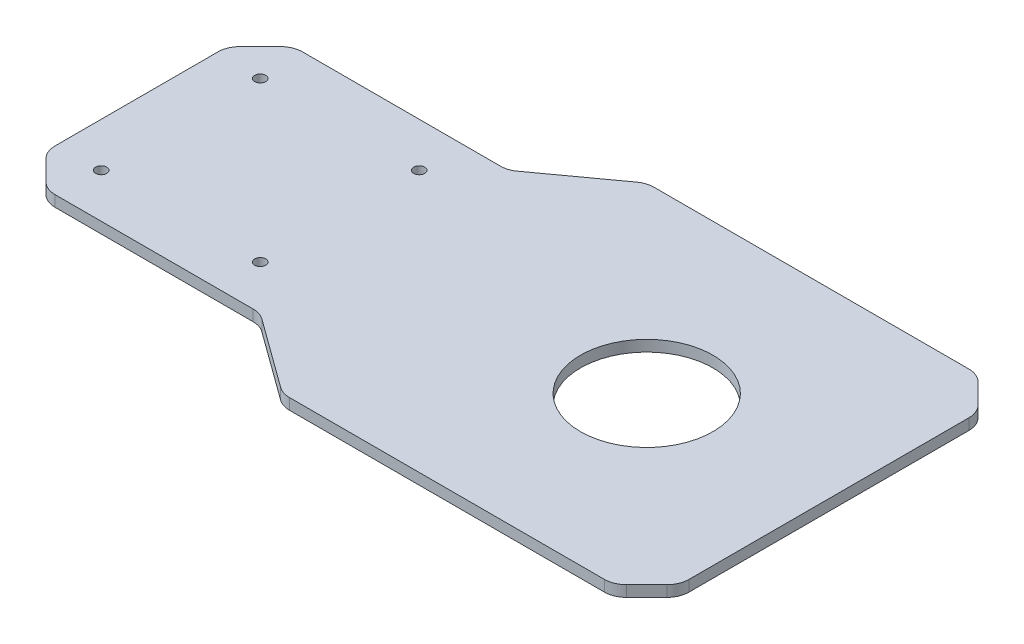
ISO-10303-21;
HEADER;
FILE_DESCRIPTION(('STEP AP214'),'2;1');
FILE_NAME('part.step','',(''),(''),'','','');
FILE_SCHEMA(('AUTOMOTIVE_DESIGN { 1 0 10303 214 1 1 1 1 }'));
ENDSEC;
DATA;
#1=APPLICATION_CONTEXT('core data for automotive mechanical design processes');
#2=APPLICATION_PROTOCOL_DEFINITION('international standard','automotive_design',2000,#1);
#3=PRODUCT_CONTEXT('',#1,'mechanical');
#4=PRODUCT('Part','Part','',(#3));
#5=PRODUCT_RELATED_PRODUCT_CATEGORY('part','',(#4));
#6=PRODUCT_DEFINITION_FORMATION('','',#4);
#7=PRODUCT_DEFINITION_CONTEXT('part definition',#1,'design');
#8=PRODUCT_DEFINITION('design','',#6,#7);
#9=PRODUCT_DEFINITION_SHAPE('','',#8);
#10=(LENGTH_UNIT() NAMED_UNIT(*) SI_UNIT(.MILLI.,.METRE.));
#11=(NAMED_UNIT(*) PLANE_ANGLE_UNIT() SI_UNIT($,.RADIAN.));
#12=(NAMED_UNIT(*) SI_UNIT($,.STERADIAN.) SOLID_ANGLE_UNIT());
#13=UNCERTAINTY_MEASURE_WITH_UNIT(LENGTH_MEASURE(1.E-05),#10,'distance_accuracy_value','');
#14=(GEOMETRIC_REPRESENTATION_CONTEXT(3) GLOBAL_UNCERTAINTY_ASSIGNED_CONTEXT((#13)) GLOBAL_UNIT_ASSIGNED_CONTEXT((#10,
#11,#12)) REPRESENTATION_CONTEXT('',''));
#15=CARTESIAN_POINT('',(0.,0.,0.));
#16=DIRECTION('',(0.,0.,1.));
#17=DIRECTION('',(1.,0.,0.));
#18=AXIS2_PLACEMENT_3D('',#15,#16,#17);
#19=CARTESIAN_POINT('',(257.5,5.,-82.5));
#20=DIRECTION('',(-1.,0.,0.));
#21=DIRECTION('',(0.,0.,1.));
#22=AXIS2_PLACEMENT_3D('',#19,#20,#21);
#23=PLANE('',#22);
#24=DIRECTION('',(0.,0.,-1.));
#25=VECTOR('',#24,1.);
#26=CARTESIAN_POINT('',(257.5,0.,-82.5));
#27=LINE('',#26,#25);
#28=CARTESIAN_POINT('',(257.5,0.,63.3578643762691));
#29=VERTEX_POINT('',#28);
#30=CARTESIAN_POINT('',(257.5,0.,-63.357864376269));
#31=VERTEX_POINT('',#30);
#32=EDGE_CURVE('E362',#29,#31,#27,.T.);
#33=ORIENTED_EDGE('',*,*,#32,.T.);
#34=DIRECTION('',(0.,-1.,0.));
#35=VECTOR('',#34,1.);
#36=CARTESIAN_POINT('',(257.5,5.,-63.357864376269));
#37=LINE('',#36,#35);
#38=CARTESIAN_POINT('',(257.5,5.,-63.357864376269));
#39=VERTEX_POINT('',#38);
#40=EDGE_CURVE('E297',#31,#39,#37,.F.);
#41=ORIENTED_EDGE('',*,*,#40,.T.);
#42=DIRECTION('',(0.,0.,-1.));
#43=VECTOR('',#42,1.);
#44=CARTESIAN_POINT('',(257.5,5.,-82.5));
#45=LINE('',#44,#43);
#46=CARTESIAN_POINT('',(257.5,5.,63.3578643762691));
#47=VERTEX_POINT('',#46);
#48=EDGE_CURVE('E379',#47,#39,#45,.T.);
#49=ORIENTED_EDGE('',*,*,#48,.F.);
#50=DIRECTION('',(0.,1.,0.));
#51=VECTOR('',#50,1.);
#52=CARTESIAN_POINT('',(257.5,0.,63.3578643762691));
#53=LINE('',#52,#51);
#54=EDGE_CURVE('E294',#47,#29,#53,.F.);
#55=ORIENTED_EDGE('',*,*,#54,.T.);
#56=EDGE_LOOP('',(#33,#41,#49,#55));
#57=FACE_BOUND('',#56,.T.);
#58=ADVANCED_FACE('F38',(#57),#23,.F.);
#59=CARTESIAN_POINT('',(92.5,5.,-82.5));
#60=DIRECTION('',(0.,0.,1.));
#61=DIRECTION('',(1.,0.,0.));
#62=AXIS2_PLACEMENT_3D('',#59,#60,#61);
#63=PLANE('',#62);
#64=DIRECTION('',(-1.,0.,0.));
#65=VECTOR('',#64,1.);
#66=CARTESIAN_POINT('',(92.5,5.,-82.5));
#67=LINE('',#66,#65);
#68=CARTESIAN_POINT('',(238.357864376269,5.,-82.5));
#69=VERTEX_POINT('',#68);
#70=CARTESIAN_POINT('',(95.7473328473115,5.,-82.5));
#71=VERTEX_POINT('',#70);
#72=EDGE_CURVE('E349',#69,#71,#67,.T.);
#73=ORIENTED_EDGE('',*,*,#72,.F.);
#74=DIRECTION('',(0.,1.,0.));
#75=VECTOR('',#74,1.);
#76=CARTESIAN_POINT('',(238.357864376269,0.,-82.5));
#77=LINE('',#76,#75);
#78=CARTESIAN_POINT('',(238.357864376269,0.,-82.5));
#79=VERTEX_POINT('',#78);
#80=EDGE_CURVE('E287',#69,#79,#77,.F.);
#81=ORIENTED_EDGE('',*,*,#80,.T.);
#82=DIRECTION('',(-1.,0.,0.));
#83=VECTOR('',#82,1.);
#84=CARTESIAN_POINT('',(92.5,0.,-82.5));
#85=LINE('',#84,#83);
#86=CARTESIAN_POINT('',(95.7473328473115,0.,-82.5));
#87=VERTEX_POINT('',#86);
#88=EDGE_CURVE('E338',#79,#87,#85,.T.);
#89=ORIENTED_EDGE('',*,*,#88,.T.);
#90=DIRECTION('',(0.,-1.,0.));
#91=VECTOR('',#90,1.);
#92=CARTESIAN_POINT('',(95.7473328473115,5.,-82.5));
#93=LINE('',#92,#91);
#94=EDGE_CURVE('E285',#87,#71,#93,.F.);
#95=ORIENTED_EDGE('',*,*,#94,.T.);
#96=EDGE_LOOP('',(#73,#81,#89,#95));
#97=FACE_BOUND('',#96,.T.);
#98=ADVANCED_FACE('F429',(#97),#63,.F.);
#99=CARTESIAN_POINT('',(56.,5.,-56.));
#100=DIRECTION('',(0.587512385943699,0.,0.809215173092264));
#101=DIRECTION('',(0.809215173092264,0.,-0.587512385943699));
#102=AXIS2_PLACEMENT_3D('',#99,#100,#101);
#103=PLANE('',#102);
#104=DIRECTION('',(-0.809215173092264,0.,0.587512385943699));
#105=VECTOR('',#104,1.);
#106=CARTESIAN_POINT('',(56.,0.,-56.));
#107=LINE('',#106,#105);
#108=CARTESIAN_POINT('',(89.8722089878746,0.,-80.5921517309227));
#109=VERTEX_POINT('',#108);
#110=CARTESIAN_POINT('',(58.6277910121254,0.,-57.9078482690774));
#111=VERTEX_POINT('',#110);
#112=EDGE_CURVE('E327',#109,#111,#107,.T.);
#113=ORIENTED_EDGE('',*,*,#112,.T.);
#114=DIRECTION('',(0.,-1.,0.));
#115=VECTOR('',#114,1.);
#116=CARTESIAN_POINT('',(58.6277910121254,5.,-57.9078482690774));
#117=LINE('',#116,#115);
#118=CARTESIAN_POINT('',(58.6277910121254,5.,-57.9078482690774));
#119=VERTEX_POINT('',#118);
#120=EDGE_CURVE('E318',#111,#119,#117,.F.);
#121=ORIENTED_EDGE('',*,*,#120,.T.);
#122=DIRECTION('',(-0.809215173092264,0.,0.587512385943699));
#123=VECTOR('',#122,1.);
#124=CARTESIAN_POINT('',(56.,5.,-56.));
#125=LINE('',#124,#123);
#126=CARTESIAN_POINT('',(89.8722089878746,5.,-80.5921517309227));
#127=VERTEX_POINT('',#126);
#128=EDGE_CURVE('E344',#127,#119,#125,.T.);
#129=ORIENTED_EDGE('',*,*,#128,.F.);
#130=DIRECTION('',(0.,-1.,0.));
#131=VECTOR('',#130,1.);
#132=CARTESIAN_POINT('',(89.8722089878746,5.,-80.5921517309227));
#133=LINE('',#132,#131);
#134=EDGE_CURVE('E315',#127,#109,#133,.T.);
#135=ORIENTED_EDGE('',*,*,#134,.T.);
#136=EDGE_LOOP('',(#113,#121,#129,#135));
#137=FACE_BOUND('',#136,.T.);
#138=ADVANCED_FACE('F334',(#137),#103,.F.);
#139=CARTESIAN_POINT('',(-56.,5.,-56.));
#140=DIRECTION('',(0.,0.,1.));
#141=DIRECTION('',(1.,0.,0.));
#142=AXIS2_PLACEMENT_3D('',#139,#140,#141);
#143=PLANE('',#142);
#144=DIRECTION('',(-1.,0.,0.));
#145=VECTOR('',#144,1.);
#146=CARTESIAN_POINT('',(-56.,0.,-56.));
#147=LINE('',#146,#145);
#148=CARTESIAN_POINT('',(52.7526671526884,0.,-56.));
#149=VERTEX_POINT('',#148);
#150=CARTESIAN_POINT('',(-36.857864376269,0.,-56.));
#151=VERTEX_POINT('',#150);
#152=EDGE_CURVE('E329',#149,#151,#147,.T.);
#153=ORIENTED_EDGE('',*,*,#152,.T.);
#154=DIRECTION('',(0.,-1.,0.));
#155=VECTOR('',#154,1.);
#156=CARTESIAN_POINT('',(-36.857864376269,5.,-56.));
#157=LINE('',#156,#155);
#158=CARTESIAN_POINT('',(-36.857864376269,5.,-56.));
#159=VERTEX_POINT('',#158);
#160=EDGE_CURVE('E282',#151,#159,#157,.F.);
#161=ORIENTED_EDGE('',*,*,#160,.T.);
#162=DIRECTION('',(-1.,0.,0.));
#163=VECTOR('',#162,1.);
#164=CARTESIAN_POINT('',(-56.,5.,-56.));
#165=LINE('',#164,#163);
#166=CARTESIAN_POINT('',(52.7526671526884,5.,-56.));
#167=VERTEX_POINT('',#166);
#168=EDGE_CURVE('E223',#167,#159,#165,.T.);
#169=ORIENTED_EDGE('',*,*,#168,.F.);
#170=DIRECTION('',(0.,-1.,0.));
#171=VECTOR('',#170,1.);
#172=CARTESIAN_POINT('',(52.7526671526884,0.,-56.));
#173=LINE('',#172,#171);
#174=EDGE_CURVE('E279',#167,#149,#173,.T.);
#175=ORIENTED_EDGE('',*,*,#174,.T.);
#176=EDGE_LOOP('',(#153,#161,#169,#175));
#177=FACE_BOUND('',#176,.T.);
#178=ADVANCED_FACE('F346',(#177),#143,.F.);
#179=CARTESIAN_POINT('',(-56.,5.,-56.));
#180=DIRECTION('',(1.,0.,0.));
#181=DIRECTION('',(0.,0.,-1.));
#182=AXIS2_PLACEMENT_3D('',#179,#180,#181);
#183=PLANE('',#182);
#184=DIRECTION('',(0.,0.,1.));
#185=VECTOR('',#184,1.);
#186=CARTESIAN_POINT('',(-56.,0.,-56.));
#187=LINE('',#186,#185);
#188=CARTESIAN_POINT('',(-56.,0.,-36.857864376269));
#189=VERTEX_POINT('',#188);
#190=CARTESIAN_POINT('',(-56.,0.,36.857864376269));
#191=VERTEX_POINT('',#190);
#192=EDGE_CURVE('E369',#189,#191,#187,.T.);
#193=ORIENTED_EDGE('',*,*,#192,.T.);
#194=DIRECTION('',(0.,-1.,0.));
#195=VECTOR('',#194,1.);
#196=CARTESIAN_POINT('',(-56.,5.,36.857864376269));
#197=LINE('',#196,#195);
#198=CARTESIAN_POINT('',(-56.,5.,36.857864376269));
#199=VERTEX_POINT('',#198);
#200=EDGE_CURVE('E221',#191,#199,#197,.F.);
#201=ORIENTED_EDGE('',*,*,#200,.T.);
#202=DIRECTION('',(0.,0.,1.));
#203=VECTOR('',#202,1.);
#204=CARTESIAN_POINT('',(-56.,5.,-56.));
#205=LINE('',#204,#203);
#206=CARTESIAN_POINT('',(-56.,5.,-36.857864376269));
#207=VERTEX_POINT('',#206);
#208=EDGE_CURVE('E204',#207,#199,#205,.T.);
#209=ORIENTED_EDGE('',*,*,#208,.F.);
#210=DIRECTION('',(0.,1.,0.));
#211=VECTOR('',#210,1.);
#212=CARTESIAN_POINT('',(-56.,0.,-36.857864376269));
#213=LINE('',#212,#211);
#214=EDGE_CURVE('E218',#207,#189,#213,.F.);
#215=ORIENTED_EDGE('',*,*,#214,.T.);
#216=EDGE_LOOP('',(#193,#201,#209,#215));
#217=FACE_BOUND('',#216,.T.);
#218=ADVANCED_FACE('F217',(#217),#183,.F.);
#219=CARTESIAN_POINT('',(-56.,5.,56.));
#220=DIRECTION('',(0.,0.,-1.));
#221=DIRECTION('',(-1.,0.,0.));
#222=AXIS2_PLACEMENT_3D('',#219,#220,#221);
#223=PLANE('',#222);
#224=DIRECTION('',(1.,0.,0.));
#225=VECTOR('',#224,1.);
#226=CARTESIAN_POINT('',(-56.,5.,56.));
#227=LINE('',#226,#225);
#228=CARTESIAN_POINT('',(-36.857864376269,5.,56.));
#229=VERTEX_POINT('',#228);
#230=CARTESIAN_POINT('',(52.7526671526884,5.,56.));
#231=VERTEX_POINT('',#230);
#232=EDGE_CURVE('E222',#229,#231,#227,.T.);
#233=ORIENTED_EDGE('',*,*,#232,.F.);
#234=DIRECTION('',(0.,1.,0.));
#235=VECTOR('',#234,1.);
#236=CARTESIAN_POINT('',(-36.857864376269,0.,56.));
#237=LINE('',#236,#235);
#238=CARTESIAN_POINT('',(-36.857864376269,0.,56.));
#239=VERTEX_POINT('',#238);
#240=EDGE_CURVE('E273',#229,#239,#237,.F.);
#241=ORIENTED_EDGE('',*,*,#240,.T.);
#242=DIRECTION('',(1.,0.,0.));
#243=VECTOR('',#242,1.);
#244=CARTESIAN_POINT('',(-56.,0.,56.));
#245=LINE('',#244,#243);
#246=CARTESIAN_POINT('',(52.7526671526884,0.,56.));
#247=VERTEX_POINT('',#246);
#248=EDGE_CURVE('E371',#239,#247,#245,.T.);
#249=ORIENTED_EDGE('',*,*,#248,.T.);
#250=DIRECTION('',(0.,-1.,0.));
#251=VECTOR('',#250,1.);
#252=CARTESIAN_POINT('',(52.7526671526884,5.,56.));
#253=LINE('',#252,#251);
#254=EDGE_CURVE('E271',#247,#231,#253,.F.);
#255=ORIENTED_EDGE('',*,*,#254,.T.);
#256=EDGE_LOOP('',(#233,#241,#249,#255));
#257=FACE_BOUND('',#256,.T.);
#258=ADVANCED_FACE('F403',(#257),#223,.F.);
#259=CARTESIAN_POINT('',(56.,5.,56.));
#260=DIRECTION('',(0.587512385943698,0.,-0.809215173092264));
#261=DIRECTION('',(-0.809215173092264,0.,-0.587512385943698));
#262=AXIS2_PLACEMENT_3D('',#259,#260,#261);
#263=PLANE('',#262);
#264=DIRECTION('',(0.809215173092264,0.,0.587512385943698));
#265=VECTOR('',#264,1.);
#266=CARTESIAN_POINT('',(56.,5.,56.));
#267=LINE('',#266,#265);
#268=CARTESIAN_POINT('',(58.6277910121254,5.,57.9078482690774));
#269=VERTEX_POINT('',#268);
#270=CARTESIAN_POINT('',(89.8722089878746,5.,80.5921517309226));
#271=VERTEX_POINT('',#270);
#272=EDGE_CURVE('E355',#269,#271,#267,.T.);
#273=ORIENTED_EDGE('',*,*,#272,.F.);
#274=DIRECTION('',(0.,-1.,0.));
#275=VECTOR('',#274,1.);
#276=CARTESIAN_POINT('',(58.6277910121254,0.,57.9078482690774));
#277=LINE('',#276,#275);
#278=CARTESIAN_POINT('',(58.6277910121254,0.,57.9078482690774));
#279=VERTEX_POINT('',#278);
#280=EDGE_CURVE('E312',#269,#279,#277,.T.);
#281=ORIENTED_EDGE('',*,*,#280,.T.);
#282=DIRECTION('',(0.809215173092264,0.,0.587512385943698));
#283=VECTOR('',#282,1.);
#284=CARTESIAN_POINT('',(56.,0.,56.));
#285=LINE('',#284,#283);
#286=CARTESIAN_POINT('',(89.8722089878746,0.,80.5921517309226));
#287=VERTEX_POINT('',#286);
#288=EDGE_CURVE('E373',#279,#287,#285,.T.);
#289=ORIENTED_EDGE('',*,*,#288,.T.);
#290=DIRECTION('',(0.,-1.,0.));
#291=VECTOR('',#290,1.);
#292=CARTESIAN_POINT('',(89.8722089878746,5.,80.5921517309226));
#293=LINE('',#292,#291);
#294=EDGE_CURVE('E310',#287,#271,#293,.F.);
#295=ORIENTED_EDGE('',*,*,#294,.T.);
#296=EDGE_LOOP('',(#273,#281,#289,#295));
#297=FACE_BOUND('',#296,.T.);
#298=ADVANCED_FACE('F628',(#297),#263,.F.);
#299=CARTESIAN_POINT('',(92.5,5.,82.5));
#300=DIRECTION('',(0.,0.,-1.));
#301=DIRECTION('',(-1.,0.,0.));
#302=AXIS2_PLACEMENT_3D('',#299,#300,#301);
#303=PLANE('',#302);
#304=DIRECTION('',(1.,0.,0.));
#305=VECTOR('',#304,1.);
#306=CARTESIAN_POINT('',(92.5,0.,82.5));
#307=LINE('',#306,#305);
#308=CARTESIAN_POINT('',(95.7473328473116,0.,82.5));
#309=VERTEX_POINT('',#308);
#310=CARTESIAN_POINT('',(238.357864376269,0.,82.5));
#311=VERTEX_POINT('',#310);
#312=EDGE_CURVE('E376',#309,#311,#307,.T.);
#313=ORIENTED_EDGE('',*,*,#312,.T.);
#314=DIRECTION('',(0.,-1.,0.));
#315=VECTOR('',#314,1.);
#316=CARTESIAN_POINT('',(238.357864376269,5.,82.5));
#317=LINE('',#316,#315);
#318=CARTESIAN_POINT('',(238.357864376269,5.,82.5));
#319=VERTEX_POINT('',#318);
#320=EDGE_CURVE('E307',#311,#319,#317,.F.);
#321=ORIENTED_EDGE('',*,*,#320,.T.);
#322=DIRECTION('',(1.,0.,0.));
#323=VECTOR('',#322,1.);
#324=CARTESIAN_POINT('',(92.5,5.,82.5));
#325=LINE('',#324,#323);
#326=CARTESIAN_POINT('',(95.7473328473116,5.,82.5));
#327=VERTEX_POINT('',#326);
#328=EDGE_CURVE('E358',#327,#319,#325,.T.);
#329=ORIENTED_EDGE('',*,*,#328,.F.);
#330=DIRECTION('',(0.,-1.,0.));
#331=VECTOR('',#330,1.);
#332=CARTESIAN_POINT('',(95.7473328473116,5.,82.5));
#333=LINE('',#332,#331);
#334=EDGE_CURVE('E304',#327,#309,#333,.T.);
#335=ORIENTED_EDGE('',*,*,#334,.T.);
#336=EDGE_LOOP('',(#313,#321,#329,#335));
#337=FACE_BOUND('',#336,.T.);
#338=ADVANCED_FACE('F560',(#337),#303,.F.);
#339=CARTESIAN_POINT('',(0.,5.,0.));
#340=DIRECTION('',(0.,1.,0.));
#341=DIRECTION('',(0.,0.,1.));
#342=AXIS2_PLACEMENT_3D('',#339,#340,#341);
#343=PLANE('',#342);
#344=CARTESIAN_POINT('',(175.,5.,0.));
#345=DIRECTION('',(0.,1.,0.));
#346=DIRECTION('',(0.,0.,1.));
#347=AXIS2_PLACEMENT_3D('',#344,#345,#346);
#348=CIRCLE('',#347,30.);
#349=CARTESIAN_POINT('',(175.,5.,30.));
#350=VERTEX_POINT('',#349);
#351=EDGE_CURVE('E742',#350,#350,#348,.T.);
#352=ORIENTED_EDGE('',*,*,#351,.F.);
#353=EDGE_LOOP('',(#352));
#354=FACE_BOUND('',#353,.T.);
#355=CARTESIAN_POINT('',(36.0000000000007,5.,36.));
#356=DIRECTION('',(0.,1.,0.));
#357=DIRECTION('',(0.,0.,1.));
#358=AXIS2_PLACEMENT_3D('',#355,#356,#357);
#359=CIRCLE('',#358,2.5);
#360=CARTESIAN_POINT('',(36.0000000000007,5.,38.5));
#361=VERTEX_POINT('',#360);
#362=EDGE_CURVE('E748',#361,#361,#359,.T.);
#363=ORIENTED_EDGE('',*,*,#362,.F.);
#364=EDGE_LOOP('',(#363));
#365=FACE_BOUND('',#364,.T.);
#366=CARTESIAN_POINT('',(-35.9999999999992,5.,36.0000000000005));
#367=DIRECTION('',(0.,1.,0.));
#368=DIRECTION('',(0.,0.,1.));
#369=AXIS2_PLACEMENT_3D('',#366,#367,#368);
#370=CIRCLE('',#369,2.5);
#371=CARTESIAN_POINT('',(-35.9999999999992,5.,38.5000000000005));
#372=VERTEX_POINT('',#371);
#373=EDGE_CURVE('E754',#372,#372,#370,.T.);
#374=ORIENTED_EDGE('',*,*,#373,.F.);
#375=EDGE_LOOP('',(#374));
#376=FACE_BOUND('',#375,.T.);
#377=CARTESIAN_POINT('',(-36.,5.,-35.9999999999995));
#378=DIRECTION('',(0.,1.,0.));
#379=DIRECTION('',(0.,0.,1.));
#380=AXIS2_PLACEMENT_3D('',#377,#378,#379);
#381=CIRCLE('',#380,2.5);
#382=CARTESIAN_POINT('',(-36.,5.,-33.4999999999995));
#383=VERTEX_POINT('',#382);
#384=EDGE_CURVE('E760',#383,#383,#381,.T.);
#385=ORIENTED_EDGE('',*,*,#384,.F.);
#386=EDGE_LOOP('',(#385));
#387=FACE_BOUND('',#386,.T.);
#388=CARTESIAN_POINT('',(36.,5.,-36.0000000000003));
#389=DIRECTION('',(0.,1.,0.));
#390=DIRECTION('',(0.,0.,1.));
#391=AXIS2_PLACEMENT_3D('',#388,#389,#390);
#392=CIRCLE('',#391,2.49999999999993);
#393=CARTESIAN_POINT('',(36.,5.,-33.5000000000003));
#394=VERTEX_POINT('',#393);
#395=EDGE_CURVE('E736',#394,#394,#392,.T.);
#396=ORIENTED_EDGE('',*,*,#395,.F.);
#397=EDGE_LOOP('',(#396));
#398=FACE_BOUND('',#397,.T.);
#399=ORIENTED_EDGE('',*,*,#208,.T.);
#400=CARTESIAN_POINT('',(-46.,5.,36.857864376269));
#401=DIRECTION('',(0.,1.,0.));
#402=DIRECTION('',(0.,0.,1.));
#403=AXIS2_PLACEMENT_3D('',#400,#401,#402);
#404=CIRCLE('',#403,10.);
#405=CARTESIAN_POINT('',(-53.0710678118655,5.,43.9289321881344));
#406=VERTEX_POINT('',#405);
#407=EDGE_CURVE('E247',#199,#406,#404,.T.);
#408=ORIENTED_EDGE('',*,*,#407,.T.);
#409=DIRECTION('',(-0.707106781186546,0.,-0.707106781186549));
#410=VECTOR('',#409,1.);
#411=CARTESIAN_POINT('',(-48.5000000000001,5.,48.4999999999999));
#412=LINE('',#411,#410);
#413=CARTESIAN_POINT('',(-43.9289321881345,5.,53.0710678118654));
#414=VERTEX_POINT('',#413);
#415=EDGE_CURVE('E230',#406,#414,#412,.F.);
#416=ORIENTED_EDGE('',*,*,#415,.T.);
#417=CARTESIAN_POINT('',(-36.857864376269,5.,46.));
#418=DIRECTION('',(0.,1.,0.));
#419=DIRECTION('',(0.,0.,1.));
#420=AXIS2_PLACEMENT_3D('',#417,#418,#419);
#421=CIRCLE('',#420,10.);
#422=EDGE_CURVE('E210',#414,#229,#421,.T.);
#423=ORIENTED_EDGE('',*,*,#422,.T.);
#424=ORIENTED_EDGE('',*,*,#232,.T.);
#425=CARTESIAN_POINT('',(52.7526671526884,5.,66.));
#426=DIRECTION('',(0.,1.,0.));
#427=DIRECTION('',(0.,0.,1.));
#428=AXIS2_PLACEMENT_3D('',#425,#426,#427);
#429=CIRCLE('',#428,10.);
#430=EDGE_CURVE('E321',#231,#269,#429,.F.);
#431=ORIENTED_EDGE('',*,*,#430,.T.);
#432=ORIENTED_EDGE('',*,*,#272,.T.);
#433=CARTESIAN_POINT('',(95.7473328473116,5.,72.5));
#434=DIRECTION('',(0.,1.,0.));
#435=DIRECTION('',(0.,0.,1.));
#436=AXIS2_PLACEMENT_3D('',#433,#434,#435);
#437=CIRCLE('',#436,10.);
#438=EDGE_CURVE('E228',#271,#327,#437,.T.);
#439=ORIENTED_EDGE('',*,*,#438,.T.);
#440=ORIENTED_EDGE('',*,*,#328,.T.);
#441=CARTESIAN_POINT('',(238.357864376269,5.,72.5));
#442=DIRECTION('',(0.,1.,0.));
#443=DIRECTION('',(0.,0.,1.));
#444=AXIS2_PLACEMENT_3D('',#441,#442,#443);
#445=CIRCLE('',#444,10.);
#446=CARTESIAN_POINT('',(245.428932188134,5.,79.5710678118655));
#447=VERTEX_POINT('',#446);
#448=EDGE_CURVE('E237',#319,#447,#445,.T.);
#449=ORIENTED_EDGE('',*,*,#448,.T.);
#450=DIRECTION('',(-0.707106781186549,0.,0.707106781186546));
#451=VECTOR('',#450,1.);
#452=CARTESIAN_POINT('',(162.5,5.,162.5));
#453=LINE('',#452,#451);
#454=CARTESIAN_POINT('',(254.571067811865,5.,70.4289321881345));
#455=VERTEX_POINT('',#454);
#456=EDGE_CURVE('E390',#447,#455,#453,.F.);
#457=ORIENTED_EDGE('',*,*,#456,.T.);
#458=CARTESIAN_POINT('',(247.5,5.,63.3578643762691));
#459=DIRECTION('',(0.,1.,0.));
#460=DIRECTION('',(0.,0.,1.));
#461=AXIS2_PLACEMENT_3D('',#458,#459,#460);
#462=CIRCLE('',#461,10.);
#463=EDGE_CURVE('E239',#455,#47,#462,.T.);
#464=ORIENTED_EDGE('',*,*,#463,.T.);
#465=ORIENTED_EDGE('',*,*,#48,.T.);
#466=CARTESIAN_POINT('',(247.5,5.,-63.357864376269));
#467=DIRECTION('',(0.,1.,0.));
#468=DIRECTION('',(0.,0.,1.));
#469=AXIS2_PLACEMENT_3D('',#466,#467,#468);
#470=CIRCLE('',#469,10.);
#471=CARTESIAN_POINT('',(254.571067811865,5.,-70.4289321881345));
#472=VERTEX_POINT('',#471);
#473=EDGE_CURVE('E241',#39,#472,#470,.T.);
#474=ORIENTED_EDGE('',*,*,#473,.T.);
#475=DIRECTION('',(0.707106781186548,0.,0.707106781186548));
#476=VECTOR('',#475,1.);
#477=CARTESIAN_POINT('',(162.5,5.,-162.5));
#478=LINE('',#477,#476);
#479=CARTESIAN_POINT('',(245.428932188134,5.,-79.5710678118655));
#480=VERTEX_POINT('',#479);
#481=EDGE_CURVE('E393',#472,#480,#478,.F.);
#482=ORIENTED_EDGE('',*,*,#481,.T.);
#483=CARTESIAN_POINT('',(238.357864376269,5.,-72.5));
#484=DIRECTION('',(0.,1.,0.));
#485=DIRECTION('',(0.,0.,1.));
#486=AXIS2_PLACEMENT_3D('',#483,#484,#485);
#487=CIRCLE('',#486,10.);
#488=EDGE_CURVE('E243',#480,#69,#487,.T.);
#489=ORIENTED_EDGE('',*,*,#488,.T.);
#490=ORIENTED_EDGE('',*,*,#72,.T.);
#491=CARTESIAN_POINT('',(95.7473328473115,5.,-72.5));
#492=DIRECTION('',(0.,1.,0.));
#493=DIRECTION('',(0.,0.,1.));
#494=AXIS2_PLACEMENT_3D('',#491,#492,#493);
#495=CIRCLE('',#494,10.);
#496=EDGE_CURVE('E235',#71,#127,#495,.T.);
#497=ORIENTED_EDGE('',*,*,#496,.T.);
#498=ORIENTED_EDGE('',*,*,#128,.T.);
#499=CARTESIAN_POINT('',(52.7526671526884,5.,-66.));
#500=DIRECTION('',(0.,1.,0.));
#501=DIRECTION('',(0.,0.,1.));
#502=AXIS2_PLACEMENT_3D('',#499,#500,#501);
#503=CIRCLE('',#502,10.);
#504=EDGE_CURVE('E11',#119,#167,#503,.F.);
#505=ORIENTED_EDGE('',*,*,#504,.T.);
#506=ORIENTED_EDGE('',*,*,#168,.T.);
#507=CARTESIAN_POINT('',(-36.857864376269,5.,-46.));
#508=DIRECTION('',(0.,1.,0.));
#509=DIRECTION('',(0.,0.,1.));
#510=AXIS2_PLACEMENT_3D('',#507,#508,#509);
#511=CIRCLE('',#510,10.);
#512=CARTESIAN_POINT('',(-43.9289321881345,5.,-53.0710678118655));
#513=VERTEX_POINT('',#512);
#514=EDGE_CURVE('E211',#159,#513,#511,.T.);
#515=ORIENTED_EDGE('',*,*,#514,.T.);
#516=DIRECTION('',(0.707106781186549,0.,-0.707106781186546));
#517=VECTOR('',#516,1.);
#518=CARTESIAN_POINT('',(-48.4999999999999,5.,-48.5000000000001));
#519=LINE('',#518,#517);
#520=CARTESIAN_POINT('',(-53.0710678118655,5.,-43.9289321881345));
#521=VERTEX_POINT('',#520);
#522=EDGE_CURVE('E206',#513,#521,#519,.F.);
#523=ORIENTED_EDGE('',*,*,#522,.T.);
#524=CARTESIAN_POINT('',(-46.,5.,-36.857864376269));
#525=DIRECTION('',(0.,1.,0.));
#526=DIRECTION('',(0.,0.,1.));
#527=AXIS2_PLACEMENT_3D('',#524,#525,#526);
#528=CIRCLE('',#527,10.);
#529=EDGE_CURVE('E201',#521,#207,#528,.T.);
#530=ORIENTED_EDGE('',*,*,#529,.T.);
#531=EDGE_LOOP('',(#399,#408,#416,#423,#424,#431,#432,#439,#440,#449,#457,#464,#465,#474,#482,
#489,#490,#497,#498,#505,#506,#515,#523,#530));
#532=FACE_BOUND('',#531,.T.);
#533=ADVANCED_FACE('F203',(#354,#365,#376,#387,#398,#532),#343,.T.);
#534=CARTESIAN_POINT('',(0.,0.,0.));
#535=DIRECTION('',(0.,1.,0.));
#536=DIRECTION('',(0.,0.,1.));
#537=AXIS2_PLACEMENT_3D('',#534,#535,#536);
#538=PLANE('',#537);
#539=CARTESIAN_POINT('',(175.,0.,0.));
#540=DIRECTION('',(0.,1.,0.));
#541=DIRECTION('',(0.,0.,1.));
#542=AXIS2_PLACEMENT_3D('',#539,#540,#541);
#543=CIRCLE('',#542,30.);
#544=CARTESIAN_POINT('',(175.,0.,30.));
#545=VERTEX_POINT('',#544);
#546=EDGE_CURVE('E745',#545,#545,#543,.T.);
#547=ORIENTED_EDGE('',*,*,#546,.T.);
#548=EDGE_LOOP('',(#547));
#549=FACE_BOUND('',#548,.T.);
#550=CARTESIAN_POINT('',(36.0000000000007,0.,36.));
#551=DIRECTION('',(0.,1.,0.));
#552=DIRECTION('',(0.,0.,1.));
#553=AXIS2_PLACEMENT_3D('',#550,#551,#552);
#554=CIRCLE('',#553,2.5);
#555=CARTESIAN_POINT('',(36.0000000000007,0.,38.5));
#556=VERTEX_POINT('',#555);
#557=EDGE_CURVE('E751',#556,#556,#554,.T.);
#558=ORIENTED_EDGE('',*,*,#557,.T.);
#559=EDGE_LOOP('',(#558));
#560=FACE_BOUND('',#559,.T.);
#561=CARTESIAN_POINT('',(-35.9999999999992,0.,36.0000000000005));
#562=DIRECTION('',(0.,1.,0.));
#563=DIRECTION('',(0.,0.,1.));
#564=AXIS2_PLACEMENT_3D('',#561,#562,#563);
#565=CIRCLE('',#564,2.5);
#566=CARTESIAN_POINT('',(-35.9999999999992,0.,38.5000000000005));
#567=VERTEX_POINT('',#566);
#568=EDGE_CURVE('E757',#567,#567,#565,.T.);
#569=ORIENTED_EDGE('',*,*,#568,.T.);
#570=EDGE_LOOP('',(#569));
#571=FACE_BOUND('',#570,.T.);
#572=CARTESIAN_POINT('',(-36.,0.,-35.9999999999995));
#573=DIRECTION('',(0.,1.,0.));
#574=DIRECTION('',(0.,0.,1.));
#575=AXIS2_PLACEMENT_3D('',#572,#573,#574);
#576=CIRCLE('',#575,2.5);
#577=CARTESIAN_POINT('',(-36.,0.,-33.4999999999995));
#578=VERTEX_POINT('',#577);
#579=EDGE_CURVE('E739',#578,#578,#576,.T.);
#580=ORIENTED_EDGE('',*,*,#579,.T.);
#581=EDGE_LOOP('',(#580));
#582=FACE_BOUND('',#581,.T.);
#583=CARTESIAN_POINT('',(36.,0.,-36.0000000000003));
#584=DIRECTION('',(0.,1.,0.));
#585=DIRECTION('',(0.,0.,1.));
#586=AXIS2_PLACEMENT_3D('',#583,#584,#585);
#587=CIRCLE('',#586,2.49999999999993);
#588=CARTESIAN_POINT('',(36.,0.,-33.5000000000003));
#589=VERTEX_POINT('',#588);
#590=EDGE_CURVE('E365',#589,#589,#587,.T.);
#591=ORIENTED_EDGE('',*,*,#590,.T.);
#592=EDGE_LOOP('',(#591));
#593=FACE_BOUND('',#592,.T.);
#594=DIRECTION('',(0.707106781186546,0.,0.707106781186549));
#595=VECTOR('',#594,1.);
#596=CARTESIAN_POINT('',(-41.,0.,56.));
#597=LINE('',#596,#595);
#598=CARTESIAN_POINT('',(-43.9289321881345,0.,53.0710678118655));
#599=VERTEX_POINT('',#598);
#600=CARTESIAN_POINT('',(-53.0710678118655,0.,43.9289321881344));
#601=VERTEX_POINT('',#600);
#602=EDGE_CURVE('E385',#599,#601,#597,.F.);
#603=ORIENTED_EDGE('',*,*,#602,.T.);
#604=CARTESIAN_POINT('',(-46.,0.,36.857864376269));
#605=DIRECTION('',(0.,1.,0.));
#606=DIRECTION('',(0.,0.,1.));
#607=AXIS2_PLACEMENT_3D('',#604,#605,#606);
#608=CIRCLE('',#607,10.);
#609=EDGE_CURVE('E269',#601,#191,#608,.F.);
#610=ORIENTED_EDGE('',*,*,#609,.T.);
#611=ORIENTED_EDGE('',*,*,#192,.F.);
#612=CARTESIAN_POINT('',(-46.,0.,-36.857864376269));
#613=DIRECTION('',(0.,1.,0.));
#614=DIRECTION('',(0.,0.,1.));
#615=AXIS2_PLACEMENT_3D('',#612,#613,#614);
#616=CIRCLE('',#615,10.);
#617=CARTESIAN_POINT('',(-53.0710678118655,0.,-43.9289321881345));
#618=VERTEX_POINT('',#617);
#619=EDGE_CURVE('E226',#189,#618,#616,.F.);
#620=ORIENTED_EDGE('',*,*,#619,.T.);
#621=DIRECTION('',(-0.707106781186549,0.,0.707106781186546));
#622=VECTOR('',#621,1.);
#623=CARTESIAN_POINT('',(-56.,0.,-41.));
#624=LINE('',#623,#622);
#625=CARTESIAN_POINT('',(-43.9289321881345,0.,-53.0710678118655));
#626=VERTEX_POINT('',#625);
#627=EDGE_CURVE('E387',#618,#626,#624,.F.);
#628=ORIENTED_EDGE('',*,*,#627,.T.);
#629=CARTESIAN_POINT('',(-36.857864376269,0.,-46.));
#630=DIRECTION('',(0.,1.,0.));
#631=DIRECTION('',(0.,0.,1.));
#632=AXIS2_PLACEMENT_3D('',#629,#630,#631);
#633=CIRCLE('',#632,10.);
#634=EDGE_CURVE('E265',#626,#151,#633,.F.);
#635=ORIENTED_EDGE('',*,*,#634,.T.);
#636=ORIENTED_EDGE('',*,*,#152,.F.);
#637=CARTESIAN_POINT('',(52.7526671526884,0.,-66.));
#638=DIRECTION('',(0.,1.,0.));
#639=DIRECTION('',(0.,0.,1.));
#640=AXIS2_PLACEMENT_3D('',#637,#638,#639);
#641=CIRCLE('',#640,10.);
#642=EDGE_CURVE('E46',#149,#111,#641,.T.);
#643=ORIENTED_EDGE('',*,*,#642,.T.);
#644=ORIENTED_EDGE('',*,*,#112,.F.);
#645=CARTESIAN_POINT('',(95.7473328473115,0.,-72.5));
#646=DIRECTION('',(0.,1.,0.));
#647=DIRECTION('',(0.,0.,1.));
#648=AXIS2_PLACEMENT_3D('',#645,#646,#647);
#649=CIRCLE('',#648,10.);
#650=EDGE_CURVE('E255',#109,#87,#649,.F.);
#651=ORIENTED_EDGE('',*,*,#650,.T.);
#652=ORIENTED_EDGE('',*,*,#88,.F.);
#653=CARTESIAN_POINT('',(238.357864376269,0.,-72.5));
#654=DIRECTION('',(0.,1.,0.));
#655=DIRECTION('',(0.,0.,1.));
#656=AXIS2_PLACEMENT_3D('',#653,#654,#655);
#657=CIRCLE('',#656,10.);
#658=CARTESIAN_POINT('',(245.428932188134,0.,-79.5710678118655));
#659=VERTEX_POINT('',#658);
#660=EDGE_CURVE('E263',#79,#659,#657,.F.);
#661=ORIENTED_EDGE('',*,*,#660,.T.);
#662=DIRECTION('',(-0.707106781186548,0.,-0.707106781186548));
#663=VECTOR('',#662,1.);
#664=CARTESIAN_POINT('',(242.5,0.,-82.5));
#665=LINE('',#664,#663);
#666=CARTESIAN_POINT('',(254.571067811865,0.,-70.4289321881345));
#667=VERTEX_POINT('',#666);
#668=EDGE_CURVE('E382',#659,#667,#665,.F.);
#669=ORIENTED_EDGE('',*,*,#668,.T.);
#670=CARTESIAN_POINT('',(247.5,0.,-63.357864376269));
#671=DIRECTION('',(0.,1.,0.));
#672=DIRECTION('',(0.,0.,1.));
#673=AXIS2_PLACEMENT_3D('',#670,#671,#672);
#674=CIRCLE('',#673,10.);
#675=EDGE_CURVE('E261',#667,#31,#674,.F.);
#676=ORIENTED_EDGE('',*,*,#675,.T.);
#677=ORIENTED_EDGE('',*,*,#32,.F.);
#678=CARTESIAN_POINT('',(247.5,0.,63.3578643762691));
#679=DIRECTION('',(0.,1.,0.));
#680=DIRECTION('',(0.,0.,1.));
#681=AXIS2_PLACEMENT_3D('',#678,#679,#680);
#682=CIRCLE('',#681,10.);
#683=CARTESIAN_POINT('',(254.571067811865,0.,70.4289321881345));
#684=VERTEX_POINT('',#683);
#685=EDGE_CURVE('E259',#29,#684,#682,.F.);
#686=ORIENTED_EDGE('',*,*,#685,.T.);
#687=DIRECTION('',(0.707106781186549,0.,-0.707106781186546));
#688=VECTOR('',#687,1.);
#689=CARTESIAN_POINT('',(257.5,0.,67.5));
#690=LINE('',#689,#688);
#691=CARTESIAN_POINT('',(245.428932188134,0.,79.5710678118655));
#692=VERTEX_POINT('',#691);
#693=EDGE_CURVE('E361',#684,#692,#690,.F.);
#694=ORIENTED_EDGE('',*,*,#693,.T.);
#695=CARTESIAN_POINT('',(238.357864376269,0.,72.5));
#696=DIRECTION('',(0.,1.,0.));
#697=DIRECTION('',(0.,0.,1.));
#698=AXIS2_PLACEMENT_3D('',#695,#696,#697);
#699=CIRCLE('',#698,10.);
#700=EDGE_CURVE('E257',#692,#311,#699,.F.);
#701=ORIENTED_EDGE('',*,*,#700,.T.);
#702=ORIENTED_EDGE('',*,*,#312,.F.);
#703=CARTESIAN_POINT('',(95.7473328473116,0.,72.5));
#704=DIRECTION('',(0.,1.,0.));
#705=DIRECTION('',(0.,0.,1.));
#706=AXIS2_PLACEMENT_3D('',#703,#704,#705);
#707=CIRCLE('',#706,10.);
#708=EDGE_CURVE('E253',#309,#287,#707,.F.);
#709=ORIENTED_EDGE('',*,*,#708,.T.);
#710=ORIENTED_EDGE('',*,*,#288,.F.);
#711=CARTESIAN_POINT('',(52.7526671526884,0.,66.));
#712=DIRECTION('',(0.,1.,0.));
#713=DIRECTION('',(0.,0.,1.));
#714=AXIS2_PLACEMENT_3D('',#711,#712,#713);
#715=CIRCLE('',#714,10.);
#716=EDGE_CURVE('E53',#279,#247,#715,.T.);
#717=ORIENTED_EDGE('',*,*,#716,.T.);
#718=ORIENTED_EDGE('',*,*,#248,.F.);
#719=CARTESIAN_POINT('',(-36.857864376269,0.,46.));
#720=DIRECTION('',(0.,1.,0.));
#721=DIRECTION('',(0.,0.,1.));
#722=AXIS2_PLACEMENT_3D('',#719,#720,#721);
#723=CIRCLE('',#722,10.);
#724=EDGE_CURVE('E61',#239,#599,#723,.F.);
#725=ORIENTED_EDGE('',*,*,#724,.T.);
#726=EDGE_LOOP('',(#603,#610,#611,#620,#628,#635,#636,#643,#644,#651,#652,#661,#669,#676,#677,
#686,#694,#701,#702,#709,#710,#717,#718,#725));
#727=FACE_BOUND('',#726,.T.);
#728=ADVANCED_FACE('F326',(#549,#560,#571,#582,#593,#727),#538,.F.);
#729=CARTESIAN_POINT('',(-56.,5.,-41.));
#730=DIRECTION('',(0.707106781186546,0.,0.707106781186549));
#731=DIRECTION('',(0.,-1.,0.));
#732=AXIS2_PLACEMENT_3D('',#729,#730,#731);
#733=PLANE('',#732);
#734=ORIENTED_EDGE('',*,*,#627,.F.);
#735=DIRECTION('',(0.,-1.,0.));
#736=VECTOR('',#735,1.);
#737=CARTESIAN_POINT('',(-53.0710678118655,5.,-43.9289321881345));
#738=LINE('',#737,#736);
#739=EDGE_CURVE('E277',#618,#521,#738,.F.);
#740=ORIENTED_EDGE('',*,*,#739,.T.);
#741=ORIENTED_EDGE('',*,*,#522,.F.);
#742=DIRECTION('',(0.,1.,0.));
#743=VECTOR('',#742,1.);
#744=CARTESIAN_POINT('',(-43.9289321881345,0.,-53.0710678118655));
#745=LINE('',#744,#743);
#746=EDGE_CURVE('E275',#513,#626,#745,.F.);
#747=ORIENTED_EDGE('',*,*,#746,.T.);
#748=EDGE_LOOP('',(#734,#740,#741,#747));
#749=FACE_BOUND('',#748,.T.);
#750=ADVANCED_FACE('F413',(#749),#733,.F.);
#751=CARTESIAN_POINT('',(-41.,5.,56.));
#752=DIRECTION('',(0.707106781186549,0.,-0.707106781186546));
#753=DIRECTION('',(0.,-1.,0.));
#754=AXIS2_PLACEMENT_3D('',#751,#752,#753);
#755=PLANE('',#754);
#756=ORIENTED_EDGE('',*,*,#415,.F.);
#757=DIRECTION('',(0.,1.,0.));
#758=VECTOR('',#757,1.);
#759=CARTESIAN_POINT('',(-53.0710678118655,0.,43.9289321881344));
#760=LINE('',#759,#758);
#761=EDGE_CURVE('E251',#406,#601,#760,.F.);
#762=ORIENTED_EDGE('',*,*,#761,.T.);
#763=ORIENTED_EDGE('',*,*,#602,.F.);
#764=DIRECTION('',(0.,-1.,0.));
#765=VECTOR('',#764,1.);
#766=CARTESIAN_POINT('',(-43.9289321881345,5.,53.0710678118655));
#767=LINE('',#766,#765);
#768=EDGE_CURVE('E249',#599,#414,#767,.F.);
#769=ORIENTED_EDGE('',*,*,#768,.T.);
#770=EDGE_LOOP('',(#756,#762,#763,#769));
#771=FACE_BOUND('',#770,.T.);
#772=ADVANCED_FACE('F407',(#771),#755,.F.);
#773=CARTESIAN_POINT('',(242.5,5.,-82.5));
#774=DIRECTION('',(-0.707106781186547,0.,0.707106781186547));
#775=DIRECTION('',(0.,-1.,0.));
#776=AXIS2_PLACEMENT_3D('',#773,#774,#775);
#777=PLANE('',#776);
#778=ORIENTED_EDGE('',*,*,#668,.F.);
#779=DIRECTION('',(0.,-1.,0.));
#780=VECTOR('',#779,1.);
#781=CARTESIAN_POINT('',(245.428932188134,5.,-79.5710678118655));
#782=LINE('',#781,#780);
#783=EDGE_CURVE('E292',#659,#480,#782,.F.);
#784=ORIENTED_EDGE('',*,*,#783,.T.);
#785=ORIENTED_EDGE('',*,*,#481,.F.);
#786=DIRECTION('',(0.,1.,0.));
#787=VECTOR('',#786,1.);
#788=CARTESIAN_POINT('',(254.571067811865,0.,-70.4289321881345));
#789=LINE('',#788,#787);
#790=EDGE_CURVE('E290',#472,#667,#789,.F.);
#791=ORIENTED_EDGE('',*,*,#790,.T.);
#792=EDGE_LOOP('',(#778,#784,#785,#791));
#793=FACE_BOUND('',#792,.T.);
#794=ADVANCED_FACE('F450',(#793),#777,.F.);
#795=CARTESIAN_POINT('',(257.5,5.,67.5));
#796=DIRECTION('',(-0.707106781186546,0.,-0.707106781186549));
#797=DIRECTION('',(0.,-1.,0.));
#798=AXIS2_PLACEMENT_3D('',#795,#796,#797);
#799=PLANE('',#798);
#800=ORIENTED_EDGE('',*,*,#693,.F.);
#801=DIRECTION('',(0.,-1.,0.));
#802=VECTOR('',#801,1.);
#803=CARTESIAN_POINT('',(254.571067811865,5.,70.4289321881345));
#804=LINE('',#803,#802);
#805=EDGE_CURVE('E302',#684,#455,#804,.F.);
#806=ORIENTED_EDGE('',*,*,#805,.T.);
#807=ORIENTED_EDGE('',*,*,#456,.F.);
#808=DIRECTION('',(0.,1.,0.));
#809=VECTOR('',#808,1.);
#810=CARTESIAN_POINT('',(245.428932188134,0.,79.5710678118655));
#811=LINE('',#810,#809);
#812=EDGE_CURVE('E300',#447,#692,#811,.F.);
#813=ORIENTED_EDGE('',*,*,#812,.T.);
#814=EDGE_LOOP('',(#800,#806,#807,#813));
#815=FACE_BOUND('',#814,.T.);
#816=ADVANCED_FACE('F456',(#815),#799,.F.);
#817=CARTESIAN_POINT('',(-46.,5.,36.857864376269));
#818=DIRECTION('',(0.,1.,0.));
#819=DIRECTION('',(0.,0.,1.));
#820=AXIS2_PLACEMENT_3D('',#817,#818,#819);
#821=CYLINDRICAL_SURFACE('',#820,10.);
#822=ORIENTED_EDGE('',*,*,#609,.F.);
#823=ORIENTED_EDGE('',*,*,#761,.F.);
#824=ORIENTED_EDGE('',*,*,#407,.F.);
#825=ORIENTED_EDGE('',*,*,#200,.F.);
#826=EDGE_LOOP('',(#822,#823,#824,#825));
#827=FACE_BOUND('',#826,.T.);
#828=ADVANCED_FACE('F409',(#827),#821,.T.);
#829=CARTESIAN_POINT('',(-36.857864376269,5.,46.));
#830=DIRECTION('',(0.,-1.,0.));
#831=DIRECTION('',(0.,0.,-1.));
#832=AXIS2_PLACEMENT_3D('',#829,#830,#831);
#833=CYLINDRICAL_SURFACE('',#832,10.);
#834=ORIENTED_EDGE('',*,*,#422,.F.);
#835=ORIENTED_EDGE('',*,*,#768,.F.);
#836=ORIENTED_EDGE('',*,*,#724,.F.);
#837=ORIENTED_EDGE('',*,*,#240,.F.);
#838=EDGE_LOOP('',(#834,#835,#836,#837));
#839=FACE_BOUND('',#838,.T.);
#840=ADVANCED_FACE('F401',(#839),#833,.T.);
#841=CARTESIAN_POINT('',(-46.,5.,-36.857864376269));
#842=DIRECTION('',(0.,-1.,0.));
#843=DIRECTION('',(0.,0.,-1.));
#844=AXIS2_PLACEMENT_3D('',#841,#842,#843);
#845=CYLINDRICAL_SURFACE('',#844,10.);
#846=ORIENTED_EDGE('',*,*,#529,.F.);
#847=ORIENTED_EDGE('',*,*,#739,.F.);
#848=ORIENTED_EDGE('',*,*,#619,.F.);
#849=ORIENTED_EDGE('',*,*,#214,.F.);
#850=EDGE_LOOP('',(#846,#847,#848,#849));
#851=FACE_BOUND('',#850,.T.);
#852=ADVANCED_FACE('F225',(#851),#845,.T.);
#853=CARTESIAN_POINT('',(-36.857864376269,5.,-46.));
#854=DIRECTION('',(0.,1.,0.));
#855=DIRECTION('',(0.,0.,1.));
#856=AXIS2_PLACEMENT_3D('',#853,#854,#855);
#857=CYLINDRICAL_SURFACE('',#856,10.);
#858=ORIENTED_EDGE('',*,*,#634,.F.);
#859=ORIENTED_EDGE('',*,*,#746,.F.);
#860=ORIENTED_EDGE('',*,*,#514,.F.);
#861=ORIENTED_EDGE('',*,*,#160,.F.);
#862=EDGE_LOOP('',(#858,#859,#860,#861));
#863=FACE_BOUND('',#862,.T.);
#864=ADVANCED_FACE('F416',(#863),#857,.T.);
#865=CARTESIAN_POINT('',(238.357864376269,5.,-72.5));
#866=DIRECTION('',(0.,-1.,0.));
#867=DIRECTION('',(0.,0.,-1.));
#868=AXIS2_PLACEMENT_3D('',#865,#866,#867);
#869=CYLINDRICAL_SURFACE('',#868,10.);
#870=ORIENTED_EDGE('',*,*,#488,.F.);
#871=ORIENTED_EDGE('',*,*,#783,.F.);
#872=ORIENTED_EDGE('',*,*,#660,.F.);
#873=ORIENTED_EDGE('',*,*,#80,.F.);
#874=EDGE_LOOP('',(#870,#871,#872,#873));
#875=FACE_BOUND('',#874,.T.);
#876=ADVANCED_FACE('F418',(#875),#869,.T.);
#877=CARTESIAN_POINT('',(247.5,5.,-63.357864376269));
#878=DIRECTION('',(0.,1.,0.));
#879=DIRECTION('',(0.,0.,1.));
#880=AXIS2_PLACEMENT_3D('',#877,#878,#879);
#881=CYLINDRICAL_SURFACE('',#880,10.);
#882=ORIENTED_EDGE('',*,*,#675,.F.);
#883=ORIENTED_EDGE('',*,*,#790,.F.);
#884=ORIENTED_EDGE('',*,*,#473,.F.);
#885=ORIENTED_EDGE('',*,*,#40,.F.);
#886=EDGE_LOOP('',(#882,#883,#884,#885));
#887=FACE_BOUND('',#886,.T.);
#888=ADVANCED_FACE('F424',(#887),#881,.T.);
#889=CARTESIAN_POINT('',(247.5,5.,63.3578643762691));
#890=DIRECTION('',(0.,-1.,0.));
#891=DIRECTION('',(0.,0.,-1.));
#892=AXIS2_PLACEMENT_3D('',#889,#890,#891);
#893=CYLINDRICAL_SURFACE('',#892,10.);
#894=ORIENTED_EDGE('',*,*,#463,.F.);
#895=ORIENTED_EDGE('',*,*,#805,.F.);
#896=ORIENTED_EDGE('',*,*,#685,.F.);
#897=ORIENTED_EDGE('',*,*,#54,.F.);
#898=EDGE_LOOP('',(#894,#895,#896,#897));
#899=FACE_BOUND('',#898,.T.);
#900=ADVANCED_FACE('F493',(#899),#893,.T.);
#901=CARTESIAN_POINT('',(238.357864376269,5.,72.5));
#902=DIRECTION('',(0.,1.,0.));
#903=DIRECTION('',(0.,0.,1.));
#904=AXIS2_PLACEMENT_3D('',#901,#902,#903);
#905=CYLINDRICAL_SURFACE('',#904,10.);
#906=ORIENTED_EDGE('',*,*,#700,.F.);
#907=ORIENTED_EDGE('',*,*,#812,.F.);
#908=ORIENTED_EDGE('',*,*,#448,.F.);
#909=ORIENTED_EDGE('',*,*,#320,.F.);
#910=EDGE_LOOP('',(#906,#907,#908,#909));
#911=FACE_BOUND('',#910,.T.);
#912=ADVANCED_FACE('F503',(#911),#905,.T.);
#913=CARTESIAN_POINT('',(52.7526671526884,5.,66.));
#914=DIRECTION('',(0.,1.,0.));
#915=DIRECTION('',(0.,0.,1.));
#916=AXIS2_PLACEMENT_3D('',#913,#914,#915);
#917=CYLINDRICAL_SURFACE('',#916,10.);
#918=ORIENTED_EDGE('',*,*,#430,.F.);
#919=ORIENTED_EDGE('',*,*,#254,.F.);
#920=ORIENTED_EDGE('',*,*,#716,.F.);
#921=ORIENTED_EDGE('',*,*,#280,.F.);
#922=EDGE_LOOP('',(#918,#919,#920,#921));
#923=FACE_BOUND('',#922,.T.);
#924=ADVANCED_FACE('F513',(#923),#917,.F.);
#925=CARTESIAN_POINT('',(52.7526671526884,5.,-66.));
#926=DIRECTION('',(0.,1.,0.));
#927=DIRECTION('',(0.,0.,1.));
#928=AXIS2_PLACEMENT_3D('',#925,#926,#927);
#929=CYLINDRICAL_SURFACE('',#928,10.);
#930=ORIENTED_EDGE('',*,*,#504,.F.);
#931=ORIENTED_EDGE('',*,*,#120,.F.);
#932=ORIENTED_EDGE('',*,*,#642,.F.);
#933=ORIENTED_EDGE('',*,*,#174,.F.);
#934=EDGE_LOOP('',(#930,#931,#932,#933));
#935=FACE_BOUND('',#934,.T.);
#936=ADVANCED_FACE('F341',(#935),#929,.F.);
#937=CARTESIAN_POINT('',(95.7473328473115,5.,-72.5));
#938=DIRECTION('',(0.,-1.,0.));
#939=DIRECTION('',(0.,0.,-1.));
#940=AXIS2_PLACEMENT_3D('',#937,#938,#939);
#941=CYLINDRICAL_SURFACE('',#940,10.);
#942=ORIENTED_EDGE('',*,*,#496,.F.);
#943=ORIENTED_EDGE('',*,*,#94,.F.);
#944=ORIENTED_EDGE('',*,*,#650,.F.);
#945=ORIENTED_EDGE('',*,*,#134,.F.);
#946=EDGE_LOOP('',(#942,#943,#944,#945));
#947=FACE_BOUND('',#946,.T.);
#948=ADVANCED_FACE('F532',(#947),#941,.T.);
#949=CARTESIAN_POINT('',(95.7473328473116,5.,72.5));
#950=DIRECTION('',(0.,-1.,0.));
#951=DIRECTION('',(0.,0.,-1.));
#952=AXIS2_PLACEMENT_3D('',#949,#950,#951);
#953=CYLINDRICAL_SURFACE('',#952,10.);
#954=ORIENTED_EDGE('',*,*,#438,.F.);
#955=ORIENTED_EDGE('',*,*,#294,.F.);
#956=ORIENTED_EDGE('',*,*,#708,.F.);
#957=ORIENTED_EDGE('',*,*,#334,.F.);
#958=EDGE_LOOP('',(#954,#955,#956,#957));
#959=FACE_BOUND('',#958,.T.);
#960=ADVANCED_FACE('F40',(#959),#953,.T.);
#961=CARTESIAN_POINT('',(36.,0.,-36.0000000000003));
#962=DIRECTION('',(0.,1.,0.));
#963=DIRECTION('',(0.,0.,1.));
#964=AXIS2_PLACEMENT_3D('',#961,#962,#963);
#965=CYLINDRICAL_SURFACE('',#964,2.49999999999993);
#966=ORIENTED_EDGE('',*,*,#590,.F.);
#967=EDGE_LOOP('',(#966));
#968=FACE_BOUND('',#967,.T.);
#969=ORIENTED_EDGE('',*,*,#395,.T.);
#970=EDGE_LOOP('',(#969));
#971=FACE_BOUND('',#970,.T.);
#972=ADVANCED_FACE('F549',(#968,#971),#965,.F.);
#973=CARTESIAN_POINT('',(-36.,0.,-35.9999999999995));
#974=DIRECTION('',(0.,1.,0.));
#975=DIRECTION('',(0.,0.,1.));
#976=AXIS2_PLACEMENT_3D('',#973,#974,#975);
#977=CYLINDRICAL_SURFACE('',#976,2.5);
#978=ORIENTED_EDGE('',*,*,#579,.F.);
#979=EDGE_LOOP('',(#978));
#980=FACE_BOUND('',#979,.T.);
#981=ORIENTED_EDGE('',*,*,#384,.T.);
#982=EDGE_LOOP('',(#981));
#983=FACE_BOUND('',#982,.T.);
#984=ADVANCED_FACE('F580',(#980,#983),#977,.F.);
#985=CARTESIAN_POINT('',(-35.9999999999992,0.,36.0000000000005));
#986=DIRECTION('',(0.,1.,0.));
#987=DIRECTION('',(0.,0.,1.));
#988=AXIS2_PLACEMENT_3D('',#985,#986,#987);
#989=CYLINDRICAL_SURFACE('',#988,2.5);
#990=ORIENTED_EDGE('',*,*,#568,.F.);
#991=EDGE_LOOP('',(#990));
#992=FACE_BOUND('',#991,.T.);
#993=ORIENTED_EDGE('',*,*,#373,.T.);
#994=EDGE_LOOP('',(#993));
#995=FACE_BOUND('',#994,.T.);
#996=ADVANCED_FACE('F590',(#992,#995),#989,.F.);
#997=CARTESIAN_POINT('',(36.0000000000007,0.,36.));
#998=DIRECTION('',(0.,1.,0.));
#999=DIRECTION('',(0.,0.,1.));
#1000=AXIS2_PLACEMENT_3D('',#997,#998,#999);
#1001=CYLINDRICAL_SURFACE('',#1000,2.5);
#1002=ORIENTED_EDGE('',*,*,#557,.F.);
#1003=EDGE_LOOP('',(#1002));
#1004=FACE_BOUND('',#1003,.T.);
#1005=ORIENTED_EDGE('',*,*,#362,.T.);
#1006=EDGE_LOOP('',(#1005));
#1007=FACE_BOUND('',#1006,.T.);
#1008=ADVANCED_FACE('F600',(#1004,#1007),#1001,.F.);
#1009=CARTESIAN_POINT('',(175.,0.,0.));
#1010=DIRECTION('',(0.,1.,0.));
#1011=DIRECTION('',(0.,0.,1.));
#1012=AXIS2_PLACEMENT_3D('',#1009,#1010,#1011);
#1013=CYLINDRICAL_SURFACE('',#1012,30.);
#1014=ORIENTED_EDGE('',*,*,#546,.F.);
#1015=EDGE_LOOP('',(#1014));
#1016=FACE_BOUND('',#1015,.T.);
#1017=ORIENTED_EDGE('',*,*,#351,.T.);
#1018=EDGE_LOOP('',(#1017));
#1019=FACE_BOUND('',#1018,.T.);
#1020=ADVANCED_FACE('F610',(#1016,#1019),#1013,.F.);
#1021=CLOSED_SHELL('',(#58,#98,#138,#178,#218,#258,#298,#338,#533,#728,#750,#772,#794,#816,#828,
#840,#852,#864,#876,#888,#900,#912,#924,#936,#948,#960,#972,#984,#996,#1008,#1020));
#1022=MANIFOLD_SOLID_BREP('B2',#1021);
#1023=ADVANCED_BREP_SHAPE_REPRESENTATION('',(#18,#1022),#14);
#1024=SHAPE_DEFINITION_REPRESENTATION(#9,#1023);
ENDSEC;
END-ISO-10303-21;
